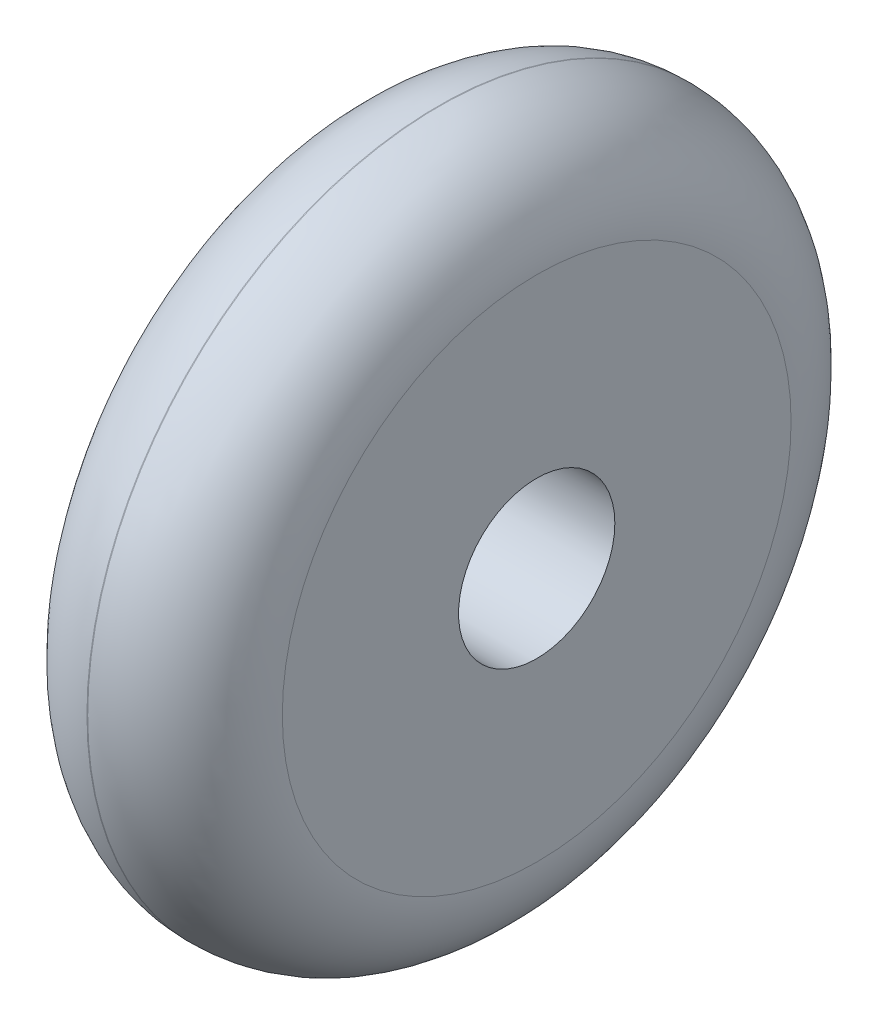
ISO-10303-21;
HEADER;
FILE_DESCRIPTION(('STEP AP214'),'2;1');
FILE_NAME('part.step','',(''),(''),'','','');
FILE_SCHEMA(('AUTOMOTIVE_DESIGN { 1 0 10303 214 1 1 1 1 }'));
ENDSEC;
DATA;
#1=APPLICATION_CONTEXT('core data for automotive mechanical design processes');
#2=APPLICATION_PROTOCOL_DEFINITION('international standard','automotive_design',2000,#1);
#3=PRODUCT_CONTEXT('',#1,'mechanical');
#4=PRODUCT('Part','Part','',(#3));
#5=PRODUCT_RELATED_PRODUCT_CATEGORY('part','',(#4));
#6=PRODUCT_DEFINITION_FORMATION('','',#4);
#7=PRODUCT_DEFINITION_CONTEXT('part definition',#1,'design');
#8=PRODUCT_DEFINITION('design','',#6,#7);
#9=PRODUCT_DEFINITION_SHAPE('','',#8);
#10=(LENGTH_UNIT() NAMED_UNIT(*) SI_UNIT(.MILLI.,.METRE.));
#11=(NAMED_UNIT(*) PLANE_ANGLE_UNIT() SI_UNIT($,.RADIAN.));
#12=(NAMED_UNIT(*) SI_UNIT($,.STERADIAN.) SOLID_ANGLE_UNIT());
#13=UNCERTAINTY_MEASURE_WITH_UNIT(LENGTH_MEASURE(1.E-05),#10,'distance_accuracy_value','');
#14=(GEOMETRIC_REPRESENTATION_CONTEXT(3) GLOBAL_UNCERTAINTY_ASSIGNED_CONTEXT((#13)) GLOBAL_UNIT_ASSIGNED_CONTEXT((#10,
#11,#12)) REPRESENTATION_CONTEXT('',''));
#15=CARTESIAN_POINT('',(0.,0.,0.));
#16=DIRECTION('',(0.,0.,1.));
#17=DIRECTION('',(1.,0.,0.));
#18=AXIS2_PLACEMENT_3D('',#15,#16,#17);
#19=CARTESIAN_POINT('',(5.,0.,0.));
#20=DIRECTION('',(1.,0.,0.));
#21=DIRECTION('',(0.,0.,-1.));
#22=AXIS2_PLACEMENT_3D('',#19,#20,#21);
#23=PLANE('',#22);
#24=CARTESIAN_POINT('',(5.,0.,0.));
#25=DIRECTION('',(1.,0.,0.));
#26=DIRECTION('',(0.,0.,-1.));
#27=AXIS2_PLACEMENT_3D('',#24,#25,#26);
#28=CIRCLE('',#27,6.51);
#29=CARTESIAN_POINT('',(5.,0.,-6.51));
#30=VERTEX_POINT('',#29);
#31=EDGE_CURVE('E10',#30,#30,#28,.T.);
#32=ORIENTED_EDGE('',*,*,#31,.T.);
#33=EDGE_LOOP('',(#32));
#34=FACE_BOUND('',#33,.T.);
#35=CARTESIAN_POINT('',(5.,0.,0.));
#36=DIRECTION('',(1.,0.,0.));
#37=DIRECTION('',(0.,0.,-1.));
#38=AXIS2_PLACEMENT_3D('',#35,#36,#37);
#39=CIRCLE('',#38,2.);
#40=CARTESIAN_POINT('',(5.,0.,-2.));
#41=VERTEX_POINT('',#40);
#42=EDGE_CURVE('E61',#41,#41,#39,.T.);
#43=ORIENTED_EDGE('',*,*,#42,.F.);
#44=EDGE_LOOP('',(#43));
#45=FACE_BOUND('',#44,.T.);
#46=ADVANCED_FACE('F37',(#34,#45),#23,.T.);
#47=CARTESIAN_POINT('',(0.,0.,0.));
#48=DIRECTION('',(1.,0.,0.));
#49=DIRECTION('',(0.,0.,-1.));
#50=AXIS2_PLACEMENT_3D('',#47,#48,#49);
#51=PLANE('',#50);
#52=CARTESIAN_POINT('',(0.,0.,0.));
#53=DIRECTION('',(1.,0.,0.));
#54=DIRECTION('',(0.,0.,-1.));
#55=AXIS2_PLACEMENT_3D('',#52,#53,#54);
#56=CIRCLE('',#55,6.51);
#57=CARTESIAN_POINT('',(0.,0.,-6.51));
#58=VERTEX_POINT('',#57);
#59=EDGE_CURVE('E45',#58,#58,#56,.F.);
#60=ORIENTED_EDGE('',*,*,#59,.T.);
#61=EDGE_LOOP('',(#60));
#62=FACE_BOUND('',#61,.T.);
#63=CARTESIAN_POINT('',(0.,0.,0.));
#64=DIRECTION('',(1.,0.,0.));
#65=DIRECTION('',(0.,0.,-1.));
#66=AXIS2_PLACEMENT_3D('',#63,#64,#65);
#67=CIRCLE('',#66,2.);
#68=CARTESIAN_POINT('',(0.,0.,-2.));
#69=VERTEX_POINT('',#68);
#70=EDGE_CURVE('E62',#69,#69,#67,.T.);
#71=ORIENTED_EDGE('',*,*,#70,.T.);
#72=EDGE_LOOP('',(#71));
#73=FACE_BOUND('',#72,.T.);
#74=ADVANCED_FACE('F74',(#62,#73),#51,.F.);
#75=CARTESIAN_POINT('',(5.,0.,0.));
#76=DIRECTION('',(-1.,0.,0.));
#77=DIRECTION('',(0.,0.,1.));
#78=AXIS2_PLACEMENT_3D('',#75,#76,#77);
#79=CYLINDRICAL_SURFACE('',#78,9.);
#80=CARTESIAN_POINT('',(2.49,0.,0.));
#81=DIRECTION('',(1.,0.,0.));
#82=DIRECTION('',(0.,0.,-1.));
#83=AXIS2_PLACEMENT_3D('',#80,#81,#82);
#84=CIRCLE('',#83,9.);
#85=CARTESIAN_POINT('',(2.49,0.,-9.));
#86=VERTEX_POINT('',#85);
#87=EDGE_CURVE('E50',#86,#86,#84,.T.);
#88=ORIENTED_EDGE('',*,*,#87,.T.);
#89=EDGE_LOOP('',(#88));
#90=FACE_BOUND('',#89,.T.);
#91=CARTESIAN_POINT('',(2.51,0.,0.));
#92=DIRECTION('',(1.,0.,0.));
#93=DIRECTION('',(0.,0.,-1.));
#94=AXIS2_PLACEMENT_3D('',#91,#92,#93);
#95=CIRCLE('',#94,9.);
#96=CARTESIAN_POINT('',(2.51,0.,-9.));
#97=VERTEX_POINT('',#96);
#98=EDGE_CURVE('E55',#97,#97,#95,.F.);
#99=ORIENTED_EDGE('',*,*,#98,.T.);
#100=EDGE_LOOP('',(#99));
#101=FACE_BOUND('',#100,.T.);
#102=ADVANCED_FACE('F79',(#90,#101),#79,.T.);
#103=CARTESIAN_POINT('',(5.,0.,0.));
#104=DIRECTION('',(-1.,0.,0.));
#105=DIRECTION('',(0.,0.,1.));
#106=AXIS2_PLACEMENT_3D('',#103,#104,#105);
#107=CYLINDRICAL_SURFACE('',#106,2.);
#108=ORIENTED_EDGE('',*,*,#42,.T.);
#109=EDGE_LOOP('',(#108));
#110=FACE_BOUND('',#109,.T.);
#111=ORIENTED_EDGE('',*,*,#70,.F.);
#112=EDGE_LOOP('',(#111));
#113=FACE_BOUND('',#112,.T.);
#114=ADVANCED_FACE('F70',(#110,#113),#107,.F.);
#115=CARTESIAN_POINT('',(2.49,0.,0.));
#116=DIRECTION('',(1.,0.,0.));
#117=DIRECTION('',(0.,0.,-1.));
#118=AXIS2_PLACEMENT_3D('',#115,#116,#117);
#119=TOROIDAL_SURFACE('',#118,6.51,2.49);
#120=ORIENTED_EDGE('',*,*,#59,.F.);
#121=EDGE_LOOP('',(#120));
#122=FACE_BOUND('',#121,.T.);
#123=ORIENTED_EDGE('',*,*,#87,.F.);
#124=EDGE_LOOP('',(#123));
#125=FACE_BOUND('',#124,.T.);
#126=ADVANCED_FACE('F85',(#122,#125),#119,.T.);
#127=CARTESIAN_POINT('',(2.51,0.,0.));
#128=DIRECTION('',(1.,0.,0.));
#129=DIRECTION('',(0.,0.,-1.));
#130=AXIS2_PLACEMENT_3D('',#127,#128,#129);
#131=TOROIDAL_SURFACE('',#130,6.51,2.49);
#132=ORIENTED_EDGE('',*,*,#98,.F.);
#133=EDGE_LOOP('',(#132));
#134=FACE_BOUND('',#133,.T.);
#135=ORIENTED_EDGE('',*,*,#31,.F.);
#136=EDGE_LOOP('',(#135));
#137=FACE_BOUND('',#136,.T.);
#138=ADVANCED_FACE('F39',(#134,#137),#131,.T.);
#139=CLOSED_SHELL('',(#46,#74,#102,#114,#126,#138));
#140=MANIFOLD_SOLID_BREP('B2',#139);
#141=ADVANCED_BREP_SHAPE_REPRESENTATION('',(#18,#140),#14);
#142=SHAPE_DEFINITION_REPRESENTATION(#9,#141);
ENDSEC;
END-ISO-10303-21;
